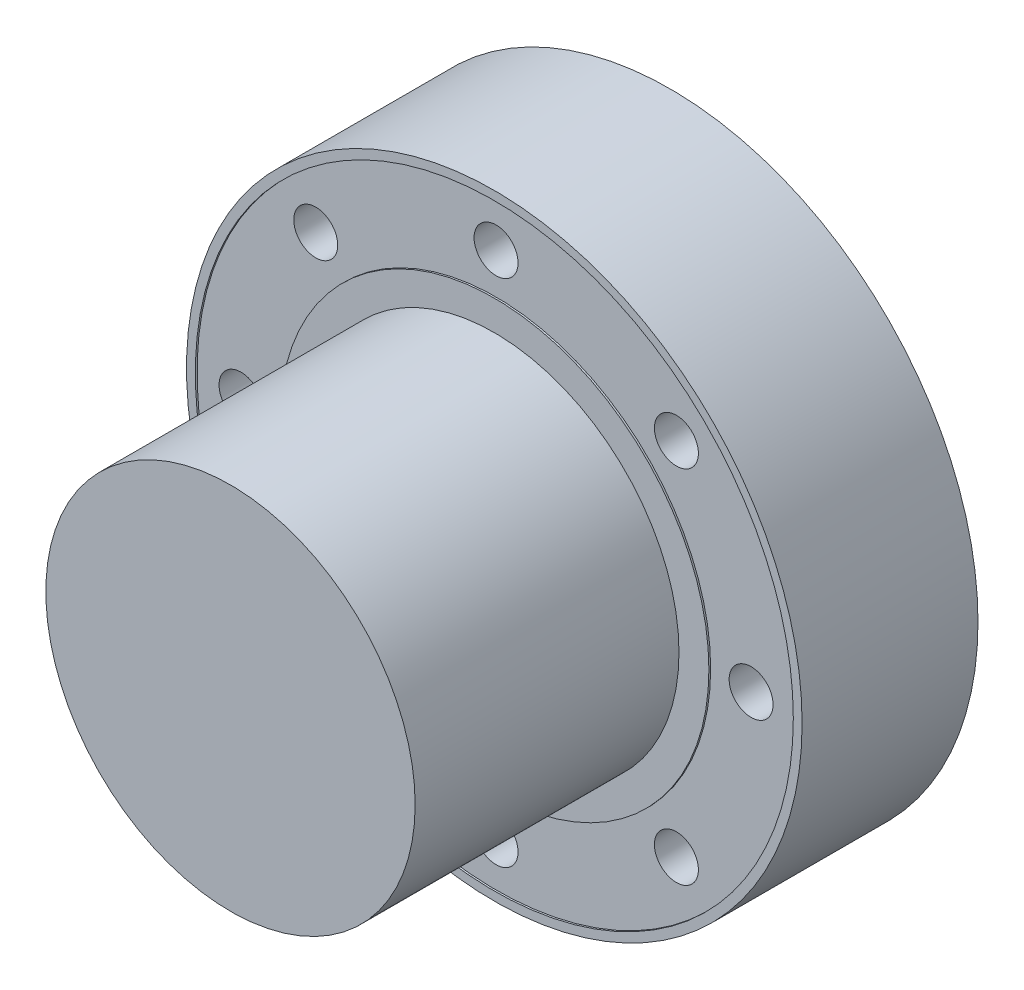
ISO-10303-21;
HEADER;
FILE_DESCRIPTION(('STEP AP214'),'2;1');
FILE_NAME('part.step','',(''),(''),'','','');
FILE_SCHEMA(('AUTOMOTIVE_DESIGN { 1 0 10303 214 1 1 1 1 }'));
ENDSEC;
DATA;
#1=APPLICATION_CONTEXT('core data for automotive mechanical design processes');
#2=APPLICATION_PROTOCOL_DEFINITION('international standard','automotive_design',2000,#1);
#3=PRODUCT_CONTEXT('',#1,'mechanical');
#4=PRODUCT('Part','Part','',(#3));
#5=PRODUCT_RELATED_PRODUCT_CATEGORY('part','',(#4));
#6=PRODUCT_DEFINITION_FORMATION('','',#4);
#7=PRODUCT_DEFINITION_CONTEXT('part definition',#1,'design');
#8=PRODUCT_DEFINITION('design','',#6,#7);
#9=PRODUCT_DEFINITION_SHAPE('','',#8);
#10=(LENGTH_UNIT() NAMED_UNIT(*) SI_UNIT(.MILLI.,.METRE.));
#11=(NAMED_UNIT(*) PLANE_ANGLE_UNIT() SI_UNIT($,.RADIAN.));
#12=(NAMED_UNIT(*) SI_UNIT($,.STERADIAN.) SOLID_ANGLE_UNIT());
#13=UNCERTAINTY_MEASURE_WITH_UNIT(LENGTH_MEASURE(1.E-05),#10,'distance_accuracy_value','');
#14=(GEOMETRIC_REPRESENTATION_CONTEXT(3) GLOBAL_UNCERTAINTY_ASSIGNED_CONTEXT((#13)) GLOBAL_UNIT_ASSIGNED_CONTEXT((#10,
#11,#12)) REPRESENTATION_CONTEXT('',''));
#15=CARTESIAN_POINT('',(0.,0.,0.));
#16=DIRECTION('',(0.,0.,1.));
#17=DIRECTION('',(1.,0.,0.));
#18=AXIS2_PLACEMENT_3D('',#15,#16,#17);
#19=CARTESIAN_POINT('',(0.,0.,200.));
#20=DIRECTION('',(0.,0.,1.));
#21=DIRECTION('',(1.,0.,0.));
#22=AXIS2_PLACEMENT_3D('',#19,#20,#21);
#23=PLANE('',#22);
#24=CARTESIAN_POINT('',(0.,0.,200.));
#25=DIRECTION('',(0.,0.,1.));
#26=DIRECTION('',(1.,0.,0.));
#27=AXIS2_PLACEMENT_3D('',#24,#25,#26);
#28=CIRCLE('',#27,340.);
#29=CARTESIAN_POINT('',(340.,0.,200.));
#30=VERTEX_POINT('',#29);
#31=EDGE_CURVE('E106',#30,#30,#28,.T.);
#32=ORIENTED_EDGE('',*,*,#31,.F.);
#33=EDGE_LOOP('',(#32));
#34=FACE_BOUND('',#33,.T.);
#35=CARTESIAN_POINT('',(0.,0.,200.));
#36=DIRECTION('',(0.,0.,1.));
#37=DIRECTION('',(1.,0.,0.));
#38=AXIS2_PLACEMENT_3D('',#35,#36,#37);
#39=CIRCLE('',#38,350.);
#40=CARTESIAN_POINT('',(350.,0.,200.));
#41=VERTEX_POINT('',#40);
#42=EDGE_CURVE('E10',#41,#41,#39,.T.);
#43=ORIENTED_EDGE('',*,*,#42,.T.);
#44=EDGE_LOOP('',(#43));
#45=FACE_BOUND('',#44,.T.);
#46=ADVANCED_FACE('F35',(#34,#45),#23,.T.);
#47=CARTESIAN_POINT('',(0.,0.,200.));
#48=DIRECTION('',(0.,0.,-1.));
#49=DIRECTION('',(-1.,0.,0.));
#50=AXIS2_PLACEMENT_3D('',#47,#48,#49);
#51=CYLINDRICAL_SURFACE('',#50,350.);
#52=ORIENTED_EDGE('',*,*,#42,.F.);
#53=EDGE_LOOP('',(#52));
#54=FACE_BOUND('',#53,.T.);
#55=CARTESIAN_POINT('',(0.,0.,0.));
#56=DIRECTION('',(0.,0.,1.));
#57=DIRECTION('',(1.,0.,0.));
#58=AXIS2_PLACEMENT_3D('',#55,#56,#57);
#59=CIRCLE('',#58,350.);
#60=CARTESIAN_POINT('',(350.,0.,0.));
#61=VERTEX_POINT('',#60);
#62=EDGE_CURVE('E43',#61,#61,#59,.T.);
#63=ORIENTED_EDGE('',*,*,#62,.T.);
#64=EDGE_LOOP('',(#63));
#65=FACE_BOUND('',#64,.T.);
#66=ADVANCED_FACE('F37',(#54,#65),#51,.T.);
#67=CARTESIAN_POINT('',(0.,0.,0.));
#68=DIRECTION('',(0.,0.,1.));
#69=DIRECTION('',(1.,0.,0.));
#70=AXIS2_PLACEMENT_3D('',#67,#68,#69);
#71=PLANE('',#70);
#72=CARTESIAN_POINT('',(-205.060966544096,205.060966544101,0.));
#73=DIRECTION('',(0.,0.,-1.));
#74=DIRECTION('',(-0.707106781186556,-0.707106781186539,0.));
#75=AXIS2_PLACEMENT_3D('',#72,#73,#74);
#76=CIRCLE('',#75,25.);
#77=CARTESIAN_POINT('',(-222.73863607376,187.383297014438,0.));
#78=VERTEX_POINT('',#77);
#79=EDGE_CURVE('E90',#78,#78,#76,.T.);
#80=ORIENTED_EDGE('',*,*,#79,.F.);
#81=EDGE_LOOP('',(#80));
#82=FACE_BOUND('',#81,.T.);
#83=CARTESIAN_POINT('',(-290.,3.03758876479353E-12,0.));
#84=DIRECTION('',(0.,0.,-1.));
#85=DIRECTION('',(0.,-1.,0.));
#86=AXIS2_PLACEMENT_3D('',#83,#84,#85);
#87=CIRCLE('',#86,25.);
#88=CARTESIAN_POINT('',(-290.,-24.999999999997,0.));
#89=VERTEX_POINT('',#88);
#90=EDGE_CURVE('E80',#89,#89,#87,.T.);
#91=ORIENTED_EDGE('',*,*,#90,.F.);
#92=EDGE_LOOP('',(#91));
#93=FACE_BOUND('',#92,.T.);
#94=CARTESIAN_POINT('',(-205.060966544101,-205.060966544097,0.));
#95=DIRECTION('',(0.,0.,-1.));
#96=DIRECTION('',(0.707106781186541,-0.707106781186554,0.));
#97=AXIS2_PLACEMENT_3D('',#94,#95,#96);
#98=CIRCLE('',#97,25.);
#99=CARTESIAN_POINT('',(-187.383297014437,-222.738636073761,0.));
#100=VERTEX_POINT('',#99);
#101=EDGE_CURVE('E77',#100,#100,#98,.T.);
#102=ORIENTED_EDGE('',*,*,#101,.F.);
#103=EDGE_LOOP('',(#102));
#104=FACE_BOUND('',#103,.T.);
#105=CARTESIAN_POINT('',(0.,-290.,0.));
#106=DIRECTION('',(0.,0.,-1.));
#107=DIRECTION('',(1.,0.,0.));
#108=AXIS2_PLACEMENT_3D('',#105,#106,#107);
#109=CIRCLE('',#108,25.);
#110=CARTESIAN_POINT('',(25.,-290.,0.));
#111=VERTEX_POINT('',#110);
#112=EDGE_CURVE('E74',#111,#111,#109,.T.);
#113=ORIENTED_EDGE('',*,*,#112,.F.);
#114=EDGE_LOOP('',(#113));
#115=FACE_BOUND('',#114,.T.);
#116=CARTESIAN_POINT('',(205.060966544098,-205.0609665441,0.));
#117=DIRECTION('',(0.,0.,-1.));
#118=DIRECTION('',(0.707106781186551,0.707106781186544,0.));
#119=AXIS2_PLACEMENT_3D('',#116,#117,#118);
#120=CIRCLE('',#119,25.);
#121=CARTESIAN_POINT('',(222.738636073761,-187.383297014436,0.));
#122=VERTEX_POINT('',#121);
#123=EDGE_CURVE('E70',#122,#122,#120,.T.);
#124=ORIENTED_EDGE('',*,*,#123,.F.);
#125=EDGE_LOOP('',(#124));
#126=FACE_BOUND('',#125,.T.);
#127=CARTESIAN_POINT('',(290.,-1.01252958826451E-12,0.));
#128=DIRECTION('',(0.,0.,-1.));
#129=DIRECTION('',(0.,1.,0.));
#130=AXIS2_PLACEMENT_3D('',#127,#128,#129);
#131=CIRCLE('',#130,25.);
#132=CARTESIAN_POINT('',(290.,24.999999999999,0.));
#133=VERTEX_POINT('',#132);
#134=EDGE_CURVE('E66',#133,#133,#131,.T.);
#135=ORIENTED_EDGE('',*,*,#134,.F.);
#136=EDGE_LOOP('',(#135));
#137=FACE_BOUND('',#136,.T.);
#138=CARTESIAN_POINT('',(205.060966544099,205.060966544098,0.));
#139=DIRECTION('',(0.,0.,-1.));
#140=DIRECTION('',(-0.707106781186546,0.707106781186549,0.));
#141=AXIS2_PLACEMENT_3D('',#138,#139,#140);
#142=CIRCLE('',#141,25.);
#143=CARTESIAN_POINT('',(187.383297014435,222.738636073762,0.));
#144=VERTEX_POINT('',#143);
#145=EDGE_CURVE('E62',#144,#144,#142,.T.);
#146=ORIENTED_EDGE('',*,*,#145,.F.);
#147=EDGE_LOOP('',(#146));
#148=FACE_BOUND('',#147,.T.);
#149=CARTESIAN_POINT('',(0.,290.,0.));
#150=DIRECTION('',(0.,0.,-1.));
#151=DIRECTION('',(-1.,0.,0.));
#152=AXIS2_PLACEMENT_3D('',#149,#150,#151);
#153=CIRCLE('',#152,25.);
#154=CARTESIAN_POINT('',(-25.,290.,0.));
#155=VERTEX_POINT('',#154);
#156=EDGE_CURVE('E58',#155,#155,#153,.T.);
#157=ORIENTED_EDGE('',*,*,#156,.F.);
#158=EDGE_LOOP('',(#157));
#159=FACE_BOUND('',#158,.T.);
#160=ORIENTED_EDGE('',*,*,#62,.F.);
#161=EDGE_LOOP('',(#160));
#162=FACE_BOUND('',#161,.T.);
#163=ADVANCED_FACE('F150',(#82,#93,#104,#115,#126,#137,#148,#159,#162),#71,.F.);
#164=CARTESIAN_POINT('',(0.,0.,198.));
#165=DIRECTION('',(0.,0.,1.));
#166=DIRECTION('',(1.,0.,0.));
#167=AXIS2_PLACEMENT_3D('',#164,#165,#166);
#168=CYLINDRICAL_SURFACE('',#167,340.);
#169=CARTESIAN_POINT('',(0.,0.,198.));
#170=DIRECTION('',(0.,0.,1.));
#171=DIRECTION('',(1.,0.,0.));
#172=AXIS2_PLACEMENT_3D('',#169,#170,#171);
#173=CIRCLE('',#172,340.);
#174=CARTESIAN_POINT('',(340.,0.,198.));
#175=VERTEX_POINT('',#174);
#176=EDGE_CURVE('E109',#175,#175,#173,.T.);
#177=ORIENTED_EDGE('',*,*,#176,.F.);
#178=EDGE_LOOP('',(#177));
#179=FACE_BOUND('',#178,.T.);
#180=ORIENTED_EDGE('',*,*,#31,.T.);
#181=EDGE_LOOP('',(#180));
#182=FACE_BOUND('',#181,.T.);
#183=ADVANCED_FACE('F139',(#179,#182),#168,.F.);
#184=CARTESIAN_POINT('',(0.,0.,198.));
#185=DIRECTION('',(0.,0.,1.));
#186=DIRECTION('',(1.,0.,0.));
#187=AXIS2_PLACEMENT_3D('',#184,#185,#186);
#188=PLANE('',#187);
#189=CARTESIAN_POINT('',(-205.060966544096,205.060966544101,198.));
#190=DIRECTION('',(0.,0.,1.));
#191=DIRECTION('',(1.,0.,0.));
#192=AXIS2_PLACEMENT_3D('',#189,#190,#191);
#193=CIRCLE('',#192,25.);
#194=CARTESIAN_POINT('',(-180.060966544096,205.060966544101,198.));
#195=VERTEX_POINT('',#194);
#196=EDGE_CURVE('E39',#195,#195,#193,.T.);
#197=ORIENTED_EDGE('',*,*,#196,.F.);
#198=EDGE_LOOP('',(#197));
#199=FACE_BOUND('',#198,.T.);
#200=CARTESIAN_POINT('',(-290.,3.03758876479353E-12,198.));
#201=DIRECTION('',(0.,0.,1.));
#202=DIRECTION('',(1.,0.,0.));
#203=AXIS2_PLACEMENT_3D('',#200,#201,#202);
#204=CIRCLE('',#203,25.);
#205=CARTESIAN_POINT('',(-265.,3.03758876479353E-12,198.));
#206=VERTEX_POINT('',#205);
#207=EDGE_CURVE('E78',#206,#206,#204,.T.);
#208=ORIENTED_EDGE('',*,*,#207,.F.);
#209=EDGE_LOOP('',(#208));
#210=FACE_BOUND('',#209,.T.);
#211=CARTESIAN_POINT('',(-205.060966544101,-205.060966544097,198.));
#212=DIRECTION('',(0.,0.,1.));
#213=DIRECTION('',(1.,0.,0.));
#214=AXIS2_PLACEMENT_3D('',#211,#212,#213);
#215=CIRCLE('',#214,25.);
#216=CARTESIAN_POINT('',(-180.060966544101,-205.060966544097,198.));
#217=VERTEX_POINT('',#216);
#218=EDGE_CURVE('E75',#217,#217,#215,.T.);
#219=ORIENTED_EDGE('',*,*,#218,.F.);
#220=EDGE_LOOP('',(#219));
#221=FACE_BOUND('',#220,.T.);
#222=CARTESIAN_POINT('',(0.,-290.,198.));
#223=DIRECTION('',(0.,0.,1.));
#224=DIRECTION('',(1.,0.,0.));
#225=AXIS2_PLACEMENT_3D('',#222,#223,#224);
#226=CIRCLE('',#225,25.);
#227=CARTESIAN_POINT('',(25.,-290.,198.));
#228=VERTEX_POINT('',#227);
#229=EDGE_CURVE('E71',#228,#228,#226,.T.);
#230=ORIENTED_EDGE('',*,*,#229,.F.);
#231=EDGE_LOOP('',(#230));
#232=FACE_BOUND('',#231,.T.);
#233=CARTESIAN_POINT('',(205.060966544098,-205.0609665441,198.));
#234=DIRECTION('',(0.,0.,1.));
#235=DIRECTION('',(1.,0.,0.));
#236=AXIS2_PLACEMENT_3D('',#233,#234,#235);
#237=CIRCLE('',#236,25.);
#238=CARTESIAN_POINT('',(230.060966544098,-205.0609665441,198.));
#239=VERTEX_POINT('',#238);
#240=EDGE_CURVE('E67',#239,#239,#237,.T.);
#241=ORIENTED_EDGE('',*,*,#240,.F.);
#242=EDGE_LOOP('',(#241));
#243=FACE_BOUND('',#242,.T.);
#244=CARTESIAN_POINT('',(290.,-1.01252958826451E-12,198.));
#245=DIRECTION('',(0.,0.,1.));
#246=DIRECTION('',(1.,0.,0.));
#247=AXIS2_PLACEMENT_3D('',#244,#245,#246);
#248=CIRCLE('',#247,25.);
#249=CARTESIAN_POINT('',(315.,-1.01252958826451E-12,198.));
#250=VERTEX_POINT('',#249);
#251=EDGE_CURVE('E63',#250,#250,#248,.T.);
#252=ORIENTED_EDGE('',*,*,#251,.F.);
#253=EDGE_LOOP('',(#252));
#254=FACE_BOUND('',#253,.T.);
#255=CARTESIAN_POINT('',(205.060966544099,205.060966544098,198.));
#256=DIRECTION('',(0.,0.,1.));
#257=DIRECTION('',(1.,0.,0.));
#258=AXIS2_PLACEMENT_3D('',#255,#256,#257);
#259=CIRCLE('',#258,25.);
#260=CARTESIAN_POINT('',(230.060966544099,205.060966544098,198.));
#261=VERTEX_POINT('',#260);
#262=EDGE_CURVE('E59',#261,#261,#259,.T.);
#263=ORIENTED_EDGE('',*,*,#262,.F.);
#264=EDGE_LOOP('',(#263));
#265=FACE_BOUND('',#264,.T.);
#266=CARTESIAN_POINT('',(0.,290.,198.));
#267=DIRECTION('',(0.,0.,1.));
#268=DIRECTION('',(1.,0.,0.));
#269=AXIS2_PLACEMENT_3D('',#266,#267,#268);
#270=CIRCLE('',#269,25.);
#271=CARTESIAN_POINT('',(25.,290.,198.));
#272=VERTEX_POINT('',#271);
#273=EDGE_CURVE('E54',#272,#272,#270,.T.);
#274=ORIENTED_EDGE('',*,*,#273,.F.);
#275=EDGE_LOOP('',(#274));
#276=FACE_BOUND('',#275,.T.);
#277=CARTESIAN_POINT('',(0.,0.,198.));
#278=DIRECTION('',(0.,0.,1.));
#279=DIRECTION('',(1.,0.,0.));
#280=AXIS2_PLACEMENT_3D('',#277,#278,#279);
#281=CIRCLE('',#280,244.);
#282=CARTESIAN_POINT('',(244.,0.,198.));
#283=VERTEX_POINT('',#282);
#284=EDGE_CURVE('E103',#283,#283,#281,.T.);
#285=ORIENTED_EDGE('',*,*,#284,.F.);
#286=EDGE_LOOP('',(#285));
#287=FACE_BOUND('',#286,.T.);
#288=ORIENTED_EDGE('',*,*,#176,.T.);
#289=EDGE_LOOP('',(#288));
#290=FACE_BOUND('',#289,.T.);
#291=ADVANCED_FACE('F131',(#199,#210,#221,#232,#243,#254,#265,#276,#287,#290),#188,.T.);
#292=CARTESIAN_POINT('',(0.,0.,198.));
#293=DIRECTION('',(0.,0.,1.));
#294=DIRECTION('',(1.,0.,0.));
#295=AXIS2_PLACEMENT_3D('',#292,#293,#294);
#296=CYLINDRICAL_SURFACE('',#295,244.);
#297=ORIENTED_EDGE('',*,*,#284,.T.);
#298=EDGE_LOOP('',(#297));
#299=FACE_BOUND('',#298,.T.);
#300=CARTESIAN_POINT('',(0.,0.,200.));
#301=DIRECTION('',(0.,0.,1.));
#302=DIRECTION('',(1.,0.,0.));
#303=AXIS2_PLACEMENT_3D('',#300,#301,#302);
#304=CIRCLE('',#303,244.);
#305=CARTESIAN_POINT('',(244.,0.,200.));
#306=VERTEX_POINT('',#305);
#307=EDGE_CURVE('E57',#306,#306,#304,.T.);
#308=ORIENTED_EDGE('',*,*,#307,.F.);
#309=EDGE_LOOP('',(#308));
#310=FACE_BOUND('',#309,.T.);
#311=ADVANCED_FACE('F128',(#299,#310),#296,.T.);
#312=CARTESIAN_POINT('',(0.,0.,500.));
#313=DIRECTION('',(0.,0.,1.));
#314=DIRECTION('',(1.,0.,0.));
#315=AXIS2_PLACEMENT_3D('',#312,#313,#314);
#316=PLANE('',#315);
#317=CARTESIAN_POINT('',(0.,0.,500.));
#318=DIRECTION('',(0.,0.,1.));
#319=DIRECTION('',(1.,0.,0.));
#320=AXIS2_PLACEMENT_3D('',#317,#318,#319);
#321=CIRCLE('',#320,210.);
#322=CARTESIAN_POINT('',(210.,0.,500.));
#323=VERTEX_POINT('',#322);
#324=EDGE_CURVE('E48',#323,#323,#321,.T.);
#325=ORIENTED_EDGE('',*,*,#324,.T.);
#326=EDGE_LOOP('',(#325));
#327=FACE_BOUND('',#326,.T.);
#328=ADVANCED_FACE('F130',(#327),#316,.T.);
#329=CARTESIAN_POINT('',(0.,0.,500.));
#330=DIRECTION('',(0.,0.,-1.));
#331=DIRECTION('',(-1.,0.,0.));
#332=AXIS2_PLACEMENT_3D('',#329,#330,#331);
#333=CYLINDRICAL_SURFACE('',#332,210.);
#334=ORIENTED_EDGE('',*,*,#324,.F.);
#335=EDGE_LOOP('',(#334));
#336=FACE_BOUND('',#335,.T.);
#337=CARTESIAN_POINT('',(0.,0.,200.));
#338=DIRECTION('',(0.,0.,1.));
#339=DIRECTION('',(1.,0.,0.));
#340=AXIS2_PLACEMENT_3D('',#337,#338,#339);
#341=CIRCLE('',#340,210.);
#342=CARTESIAN_POINT('',(210.,0.,200.));
#343=VERTEX_POINT('',#342);
#344=EDGE_CURVE('E51',#343,#343,#341,.T.);
#345=ORIENTED_EDGE('',*,*,#344,.T.);
#346=EDGE_LOOP('',(#345));
#347=FACE_BOUND('',#346,.T.);
#348=ADVANCED_FACE('F119',(#336,#347),#333,.T.);
#349=ORIENTED_EDGE('',*,*,#344,.F.);
#350=EDGE_LOOP('',(#349));
#351=FACE_BOUND('',#350,.T.);
#352=ORIENTED_EDGE('',*,*,#307,.T.);
#353=EDGE_LOOP('',(#352));
#354=FACE_BOUND('',#353,.T.);
#355=ADVANCED_FACE('F121',(#351,#354),#23,.T.);
#356=CARTESIAN_POINT('',(0.,290.,500.));
#357=DIRECTION('',(0.,0.,-1.));
#358=DIRECTION('',(-1.,0.,0.));
#359=AXIS2_PLACEMENT_3D('',#356,#357,#358);
#360=CYLINDRICAL_SURFACE('',#359,25.);
#361=ORIENTED_EDGE('',*,*,#273,.T.);
#362=EDGE_LOOP('',(#361));
#363=FACE_BOUND('',#362,.T.);
#364=ORIENTED_EDGE('',*,*,#156,.T.);
#365=EDGE_LOOP('',(#364));
#366=FACE_BOUND('',#365,.T.);
#367=ADVANCED_FACE('F124',(#363,#366),#360,.F.);
#368=CARTESIAN_POINT('',(205.060966544099,205.060966544098,500.));
#369=DIRECTION('',(0.,0.,-1.));
#370=DIRECTION('',(-1.,0.,0.));
#371=AXIS2_PLACEMENT_3D('',#368,#369,#370);
#372=CYLINDRICAL_SURFACE('',#371,25.);
#373=ORIENTED_EDGE('',*,*,#262,.T.);
#374=EDGE_LOOP('',(#373));
#375=FACE_BOUND('',#374,.T.);
#376=ORIENTED_EDGE('',*,*,#145,.T.);
#377=EDGE_LOOP('',(#376));
#378=FACE_BOUND('',#377,.T.);
#379=ADVANCED_FACE('F183',(#375,#378),#372,.F.);
#380=CARTESIAN_POINT('',(290.,-1.01252958826451E-12,500.));
#381=DIRECTION('',(0.,0.,-1.));
#382=DIRECTION('',(-1.,0.,0.));
#383=AXIS2_PLACEMENT_3D('',#380,#381,#382);
#384=CYLINDRICAL_SURFACE('',#383,25.);
#385=ORIENTED_EDGE('',*,*,#251,.T.);
#386=EDGE_LOOP('',(#385));
#387=FACE_BOUND('',#386,.T.);
#388=ORIENTED_EDGE('',*,*,#134,.T.);
#389=EDGE_LOOP('',(#388));
#390=FACE_BOUND('',#389,.T.);
#391=ADVANCED_FACE('F188',(#387,#390),#384,.F.);
#392=CARTESIAN_POINT('',(205.060966544098,-205.0609665441,500.));
#393=DIRECTION('',(0.,0.,-1.));
#394=DIRECTION('',(-1.,0.,0.));
#395=AXIS2_PLACEMENT_3D('',#392,#393,#394);
#396=CYLINDRICAL_SURFACE('',#395,25.);
#397=ORIENTED_EDGE('',*,*,#240,.T.);
#398=EDGE_LOOP('',(#397));
#399=FACE_BOUND('',#398,.T.);
#400=ORIENTED_EDGE('',*,*,#123,.T.);
#401=EDGE_LOOP('',(#400));
#402=FACE_BOUND('',#401,.T.);
#403=ADVANCED_FACE('F194',(#399,#402),#396,.F.);
#404=CARTESIAN_POINT('',(0.,-290.,500.));
#405=DIRECTION('',(0.,0.,-1.));
#406=DIRECTION('',(-1.,0.,0.));
#407=AXIS2_PLACEMENT_3D('',#404,#405,#406);
#408=CYLINDRICAL_SURFACE('',#407,25.);
#409=ORIENTED_EDGE('',*,*,#229,.T.);
#410=EDGE_LOOP('',(#409));
#411=FACE_BOUND('',#410,.T.);
#412=ORIENTED_EDGE('',*,*,#112,.T.);
#413=EDGE_LOOP('',(#412));
#414=FACE_BOUND('',#413,.T.);
#415=ADVANCED_FACE('F198',(#411,#414),#408,.F.);
#416=CARTESIAN_POINT('',(-205.060966544101,-205.060966544097,500.));
#417=DIRECTION('',(0.,0.,-1.));
#418=DIRECTION('',(-1.,0.,0.));
#419=AXIS2_PLACEMENT_3D('',#416,#417,#418);
#420=CYLINDRICAL_SURFACE('',#419,25.);
#421=ORIENTED_EDGE('',*,*,#218,.T.);
#422=EDGE_LOOP('',(#421));
#423=FACE_BOUND('',#422,.T.);
#424=ORIENTED_EDGE('',*,*,#101,.T.);
#425=EDGE_LOOP('',(#424));
#426=FACE_BOUND('',#425,.T.);
#427=ADVANCED_FACE('F202',(#423,#426),#420,.F.);
#428=CARTESIAN_POINT('',(-290.,3.03758876479353E-12,500.));
#429=DIRECTION('',(0.,0.,-1.));
#430=DIRECTION('',(-1.,0.,0.));
#431=AXIS2_PLACEMENT_3D('',#428,#429,#430);
#432=CYLINDRICAL_SURFACE('',#431,25.);
#433=ORIENTED_EDGE('',*,*,#207,.T.);
#434=EDGE_LOOP('',(#433));
#435=FACE_BOUND('',#434,.T.);
#436=ORIENTED_EDGE('',*,*,#90,.T.);
#437=EDGE_LOOP('',(#436));
#438=FACE_BOUND('',#437,.T.);
#439=ADVANCED_FACE('F206',(#435,#438),#432,.F.);
#440=CARTESIAN_POINT('',(-205.060966544096,205.060966544101,500.));
#441=DIRECTION('',(0.,0.,-1.));
#442=DIRECTION('',(-1.,0.,0.));
#443=AXIS2_PLACEMENT_3D('',#440,#441,#442);
#444=CYLINDRICAL_SURFACE('',#443,25.);
#445=ORIENTED_EDGE('',*,*,#196,.T.);
#446=EDGE_LOOP('',(#445));
#447=FACE_BOUND('',#446,.T.);
#448=ORIENTED_EDGE('',*,*,#79,.T.);
#449=EDGE_LOOP('',(#448));
#450=FACE_BOUND('',#449,.T.);
#451=ADVANCED_FACE('F210',(#447,#450),#444,.F.);
#452=CLOSED_SHELL('',(#46,#66,#163,#183,#291,#311,#328,#348,#355,#367,#379,#391,#403,#415,#427,
#439,#451));
#453=MANIFOLD_SOLID_BREP('B2',#452);
#454=ADVANCED_BREP_SHAPE_REPRESENTATION('',(#18,#453),#14);
#455=SHAPE_DEFINITION_REPRESENTATION(#9,#454);
ENDSEC;
END-ISO-10303-21;
